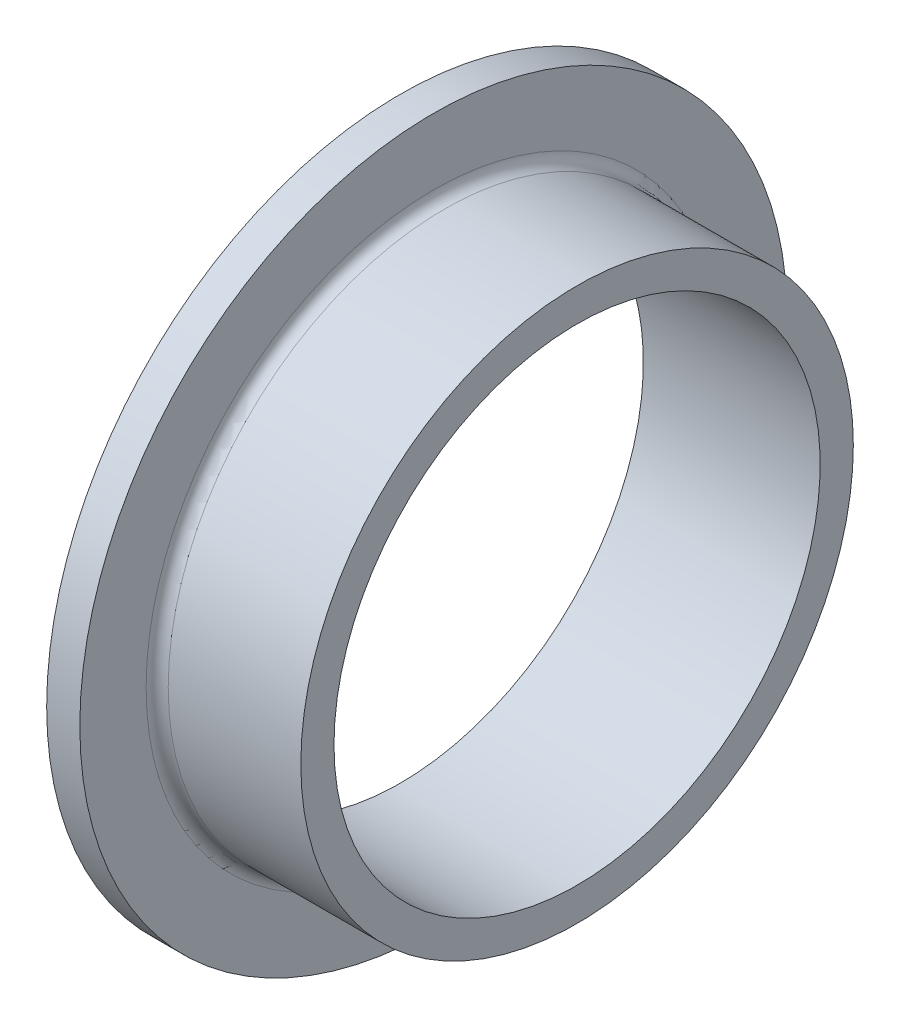
ISO-10303-21;
HEADER;
FILE_DESCRIPTION(('STEP AP214'),'2;1');
FILE_NAME('part.step','',(''),(''),'','','');
FILE_SCHEMA(('AUTOMOTIVE_DESIGN { 1 0 10303 214 1 1 1 1 }'));
ENDSEC;
DATA;
#1=APPLICATION_CONTEXT('core data for automotive mechanical design processes');
#2=APPLICATION_PROTOCOL_DEFINITION('international standard','automotive_design',2000,#1);
#3=PRODUCT_CONTEXT('',#1,'mechanical');
#4=PRODUCT('Part','Part','',(#3));
#5=PRODUCT_RELATED_PRODUCT_CATEGORY('part','',(#4));
#6=PRODUCT_DEFINITION_FORMATION('','',#4);
#7=PRODUCT_DEFINITION_CONTEXT('part definition',#1,'design');
#8=PRODUCT_DEFINITION('design','',#6,#7);
#9=PRODUCT_DEFINITION_SHAPE('','',#8);
#10=(LENGTH_UNIT() NAMED_UNIT(*) SI_UNIT(.MILLI.,.METRE.));
#11=(NAMED_UNIT(*) PLANE_ANGLE_UNIT() SI_UNIT($,.RADIAN.));
#12=(NAMED_UNIT(*) SI_UNIT($,.STERADIAN.) SOLID_ANGLE_UNIT());
#13=UNCERTAINTY_MEASURE_WITH_UNIT(LENGTH_MEASURE(1.E-05),#10,'distance_accuracy_value','');
#14=(GEOMETRIC_REPRESENTATION_CONTEXT(3) GLOBAL_UNCERTAINTY_ASSIGNED_CONTEXT((#13)) GLOBAL_UNIT_ASSIGNED_CONTEXT((#10,
#11,#12)) REPRESENTATION_CONTEXT('',''));
#15=CARTESIAN_POINT('',(0.,0.,0.));
#16=DIRECTION('',(0.,0.,1.));
#17=DIRECTION('',(1.,0.,0.));
#18=AXIS2_PLACEMENT_3D('',#15,#16,#17);
#19=CARTESIAN_POINT('',(0.,0.,0.));
#20=DIRECTION('',(-1.,0.,0.));
#21=DIRECTION('',(0.,0.,1.));
#22=AXIS2_PLACEMENT_3D('',#19,#20,#21);
#23=CYLINDRICAL_SURFACE('',#22,11.);
#24=CARTESIAN_POINT('',(8.00000000000001,0.,0.));
#25=DIRECTION('',(-1.,0.,0.));
#26=DIRECTION('',(0.,0.,1.));
#27=AXIS2_PLACEMENT_3D('',#24,#25,#26);
#28=CIRCLE('',#27,11.);
#29=CARTESIAN_POINT('',(8.00000000000001,0.,11.));
#30=VERTEX_POINT('',#29);
#31=EDGE_CURVE('E77',#30,#30,#28,.T.);
#32=ORIENTED_EDGE('',*,*,#31,.F.);
#33=EDGE_LOOP('',(#32));
#34=FACE_BOUND('',#33,.T.);
#35=CARTESIAN_POINT('',(0.,0.,0.));
#36=DIRECTION('',(-1.,0.,0.));
#37=DIRECTION('',(0.,0.,1.));
#38=AXIS2_PLACEMENT_3D('',#35,#36,#37);
#39=CIRCLE('',#38,11.);
#40=CARTESIAN_POINT('',(0.,0.,11.));
#41=VERTEX_POINT('',#40);
#42=EDGE_CURVE('E58',#41,#41,#39,.T.);
#43=ORIENTED_EDGE('',*,*,#42,.T.);
#44=EDGE_LOOP('',(#43));
#45=FACE_BOUND('',#44,.T.);
#46=ADVANCED_FACE('F45',(#34,#45),#23,.F.);
#47=CARTESIAN_POINT('',(0.,11.,0.));
#48=DIRECTION('',(1.,0.,0.));
#49=DIRECTION('',(0.,0.,-1.));
#50=AXIS2_PLACEMENT_3D('',#47,#48,#49);
#51=PLANE('',#50);
#52=ORIENTED_EDGE('',*,*,#42,.F.);
#53=EDGE_LOOP('',(#52));
#54=FACE_BOUND('',#53,.T.);
#55=CARTESIAN_POINT('',(0.,0.,0.));
#56=DIRECTION('',(-1.,0.,0.));
#57=DIRECTION('',(0.,0.,1.));
#58=AXIS2_PLACEMENT_3D('',#55,#56,#57);
#59=CIRCLE('',#58,16.);
#60=CARTESIAN_POINT('',(0.,0.,16.));
#61=VERTEX_POINT('',#60);
#62=EDGE_CURVE('E63',#61,#61,#59,.T.);
#63=ORIENTED_EDGE('',*,*,#62,.T.);
#64=EDGE_LOOP('',(#63));
#65=FACE_BOUND('',#64,.T.);
#66=ADVANCED_FACE('F86',(#54,#65),#51,.F.);
#67=CARTESIAN_POINT('',(0.,0.,0.));
#68=DIRECTION('',(-1.,0.,0.));
#69=DIRECTION('',(0.,0.,1.));
#70=AXIS2_PLACEMENT_3D('',#67,#68,#69);
#71=CYLINDRICAL_SURFACE('',#70,16.);
#72=ORIENTED_EDGE('',*,*,#62,.F.);
#73=EDGE_LOOP('',(#72));
#74=FACE_BOUND('',#73,.T.);
#75=CARTESIAN_POINT('',(1.5,0.,0.));
#76=DIRECTION('',(-1.,0.,0.));
#77=DIRECTION('',(0.,0.,1.));
#78=AXIS2_PLACEMENT_3D('',#75,#76,#77);
#79=CIRCLE('',#78,16.);
#80=CARTESIAN_POINT('',(1.5,0.,16.));
#81=VERTEX_POINT('',#80);
#82=EDGE_CURVE('E69',#81,#81,#79,.T.);
#83=ORIENTED_EDGE('',*,*,#82,.T.);
#84=EDGE_LOOP('',(#83));
#85=FACE_BOUND('',#84,.T.);
#86=ADVANCED_FACE('F91',(#74,#85),#71,.T.);
#87=CARTESIAN_POINT('',(1.5,16.,0.));
#88=DIRECTION('',(-1.,0.,0.));
#89=DIRECTION('',(0.,0.,1.));
#90=AXIS2_PLACEMENT_3D('',#87,#88,#89);
#91=PLANE('',#90);
#92=CARTESIAN_POINT('',(1.5,0.,0.));
#93=DIRECTION('',(-1.,0.,0.));
#94=DIRECTION('',(0.,0.,1.));
#95=AXIS2_PLACEMENT_3D('',#92,#93,#94);
#96=CIRCLE('',#95,13.);
#97=CARTESIAN_POINT('',(1.5,0.,13.));
#98=VERTEX_POINT('',#97);
#99=EDGE_CURVE('E53',#98,#98,#96,.T.);
#100=ORIENTED_EDGE('',*,*,#99,.T.);
#101=EDGE_LOOP('',(#100));
#102=FACE_BOUND('',#101,.T.);
#103=ORIENTED_EDGE('',*,*,#82,.F.);
#104=EDGE_LOOP('',(#103));
#105=FACE_BOUND('',#104,.T.);
#106=ADVANCED_FACE('F97',(#102,#105),#91,.F.);
#107=CARTESIAN_POINT('',(0.,0.,0.));
#108=DIRECTION('',(-1.,0.,0.));
#109=DIRECTION('',(0.,0.,1.));
#110=AXIS2_PLACEMENT_3D('',#107,#108,#109);
#111=CYLINDRICAL_SURFACE('',#110,12.5);
#112=CARTESIAN_POINT('',(2.,0.,0.));
#113=DIRECTION('',(-1.,0.,0.));
#114=DIRECTION('',(0.,0.,1.));
#115=AXIS2_PLACEMENT_3D('',#112,#113,#114);
#116=CIRCLE('',#115,12.5);
#117=CARTESIAN_POINT('',(2.,0.,12.5));
#118=VERTEX_POINT('',#117);
#119=EDGE_CURVE('E10',#118,#118,#116,.F.);
#120=ORIENTED_EDGE('',*,*,#119,.T.);
#121=EDGE_LOOP('',(#120));
#122=FACE_BOUND('',#121,.T.);
#123=CARTESIAN_POINT('',(8.,0.,0.));
#124=DIRECTION('',(-1.,0.,0.));
#125=DIRECTION('',(0.,0.,1.));
#126=AXIS2_PLACEMENT_3D('',#123,#124,#125);
#127=CIRCLE('',#126,12.5);
#128=CARTESIAN_POINT('',(8.,0.,12.5));
#129=VERTEX_POINT('',#128);
#130=EDGE_CURVE('E73',#129,#129,#127,.T.);
#131=ORIENTED_EDGE('',*,*,#130,.T.);
#132=EDGE_LOOP('',(#131));
#133=FACE_BOUND('',#132,.T.);
#134=ADVANCED_FACE('F102',(#122,#133),#111,.T.);
#135=CARTESIAN_POINT('',(8.,12.5,0.));
#136=DIRECTION('',(-1.,0.,0.));
#137=DIRECTION('',(0.,0.,1.));
#138=AXIS2_PLACEMENT_3D('',#135,#136,#137);
#139=PLANE('',#138);
#140=ORIENTED_EDGE('',*,*,#130,.F.);
#141=EDGE_LOOP('',(#140));
#142=FACE_BOUND('',#141,.T.);
#143=ORIENTED_EDGE('',*,*,#31,.T.);
#144=EDGE_LOOP('',(#143));
#145=FACE_BOUND('',#144,.T.);
#146=ADVANCED_FACE('F82',(#142,#145),#139,.F.);
#147=CARTESIAN_POINT('',(2.,0.,0.));
#148=DIRECTION('',(-1.,0.,0.));
#149=DIRECTION('',(0.,0.,1.));
#150=AXIS2_PLACEMENT_3D('',#147,#148,#149);
#151=TOROIDAL_SURFACE('',#150,13.,0.5);
#152=ORIENTED_EDGE('',*,*,#119,.F.);
#153=EDGE_LOOP('',(#152));
#154=FACE_BOUND('',#153,.T.);
#155=ORIENTED_EDGE('',*,*,#99,.F.);
#156=EDGE_LOOP('',(#155));
#157=FACE_BOUND('',#156,.T.);
#158=ADVANCED_FACE('F47',(#154,#157),#151,.F.);
#159=CLOSED_SHELL('',(#46,#66,#86,#106,#134,#146,#158));
#160=MANIFOLD_SOLID_BREP('B2',#159);
#161=ADVANCED_BREP_SHAPE_REPRESENTATION('',(#18,#160),#14);
#162=SHAPE_DEFINITION_REPRESENTATION(#9,#161);
ENDSEC;
END-ISO-10303-21;
